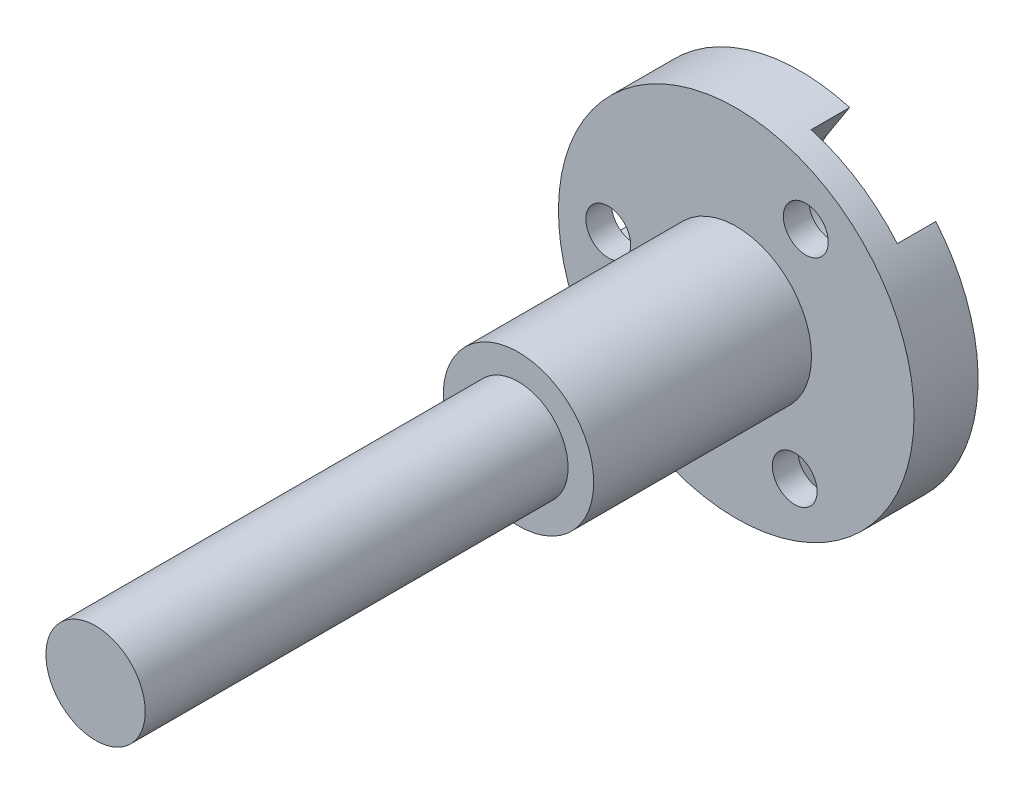
ISO-10303-21;
HEADER;
FILE_DESCRIPTION(('STEP AP214'),'2;1');
FILE_NAME('part.step','',(''),(''),'','','');
FILE_SCHEMA(('AUTOMOTIVE_DESIGN { 1 0 10303 214 1 1 1 1 }'));
ENDSEC;
DATA;
#1=APPLICATION_CONTEXT('core data for automotive mechanical design processes');
#2=APPLICATION_PROTOCOL_DEFINITION('international standard','automotive_design',2000,#1);
#3=PRODUCT_CONTEXT('',#1,'mechanical');
#4=PRODUCT('Part','Part','',(#3));
#5=PRODUCT_RELATED_PRODUCT_CATEGORY('part','',(#4));
#6=PRODUCT_DEFINITION_FORMATION('','',#4);
#7=PRODUCT_DEFINITION_CONTEXT('part definition',#1,'design');
#8=PRODUCT_DEFINITION('design','',#6,#7);
#9=PRODUCT_DEFINITION_SHAPE('','',#8);
#10=(LENGTH_UNIT() NAMED_UNIT(*) SI_UNIT(.MILLI.,.METRE.));
#11=(NAMED_UNIT(*) PLANE_ANGLE_UNIT() SI_UNIT($,.RADIAN.));
#12=(NAMED_UNIT(*) SI_UNIT($,.STERADIAN.) SOLID_ANGLE_UNIT());
#13=UNCERTAINTY_MEASURE_WITH_UNIT(LENGTH_MEASURE(1.E-05),#10,'distance_accuracy_value','');
#14=(GEOMETRIC_REPRESENTATION_CONTEXT(3) GLOBAL_UNCERTAINTY_ASSIGNED_CONTEXT((#13)) GLOBAL_UNIT_ASSIGNED_CONTEXT((#10,
#11,#12)) REPRESENTATION_CONTEXT('',''));
#15=CARTESIAN_POINT('',(0.,0.,0.));
#16=DIRECTION('',(0.,0.,1.));
#17=DIRECTION('',(1.,0.,0.));
#18=AXIS2_PLACEMENT_3D('',#15,#16,#17);
#19=CARTESIAN_POINT('',(5.42654757145298,8.39955840831726,55.));
#20=DIRECTION('',(0.,0.,-1.));
#21=DIRECTION('',(-1.,0.,0.));
#22=AXIS2_PLACEMENT_3D('',#19,#20,#21);
#23=CYLINDRICAL_SURFACE('',#22,1.75000000001934);
#24=CARTESIAN_POINT('',(5.42654757145298,8.39955840831726,5.));
#25=DIRECTION('',(0.,0.,1.));
#26=DIRECTION('',(1.,0.,0.));
#27=AXIS2_PLACEMENT_3D('',#24,#25,#26);
#28=CIRCLE('',#27,1.75000000001934);
#29=CARTESIAN_POINT('',(3.67654757143364,8.39955840831726,5.));
#30=VERTEX_POINT('',#29);
#31=EDGE_CURVE('E221',#30,#30,#28,.T.);
#32=CARTESIAN_POINT('',(5.42654757145298,8.39955840831726,3.));
#33=DIRECTION('',(0.,0.,-1.));
#34=DIRECTION('',(-1.,0.,0.));
#35=AXIS2_PLACEMENT_3D('',#32,#33,#34);
#36=CIRCLE('',#35,1.75000000001934);
#37=CARTESIAN_POINT('',(3.67654757143364,8.39955840831726,3.00000000000001));
#38=VERTEX_POINT('',#37);
#39=EDGE_CURVE('E43',#38,#38,#36,.F.);
#40=CARTESIAN_POINT('',(3.67654757143364,8.39955840831726,5.));
#41=CARTESIAN_POINT('',(3.67654757143364,8.39955840831726,4.97916666666666));
#42=CARTESIAN_POINT('',(3.67654757143364,8.39955840831726,4.95833333333333));
#43=CARTESIAN_POINT('',(3.67654757143364,8.39955840831726,4.91666666666666));
#44=CARTESIAN_POINT('',(3.67654757143364,8.39955840831726,4.89583333333333));
#45=CARTESIAN_POINT('',(3.67654757143364,8.39955840831726,4.85416666666666));
#46=CARTESIAN_POINT('',(3.67654757143364,8.39955840831726,4.83333333333333));
#47=CARTESIAN_POINT('',(3.67654757143364,8.39955840831726,4.79166666666666));
#48=CARTESIAN_POINT('',(3.67654757143364,8.39955840831726,4.77083333333333));
#49=CARTESIAN_POINT('',(3.67654757143364,8.39955840831726,4.72916666666666));
#50=CARTESIAN_POINT('',(3.67654757143364,8.39955840831726,4.70833333333333));
#51=CARTESIAN_POINT('',(3.67654757143364,8.39955840831726,4.66666666666666));
#52=CARTESIAN_POINT('',(3.67654757143364,8.39955840831726,4.64583333333333));
#53=CARTESIAN_POINT('',(3.67654757143364,8.39955840831726,4.60416666666666));
#54=CARTESIAN_POINT('',(3.67654757143364,8.39955840831726,4.58333333333333));
#55=CARTESIAN_POINT('',(3.67654757143364,8.39955840831726,4.54166666666666));
#56=CARTESIAN_POINT('',(3.67654757143364,8.39955840831726,4.52083333333333));
#57=CARTESIAN_POINT('',(3.67654757143364,8.39955840831726,4.47916666666667));
#58=CARTESIAN_POINT('',(3.67654757143364,8.39955840831726,4.45833333333333));
#59=CARTESIAN_POINT('',(3.67654757143364,8.39955840831726,4.41666666666667));
#60=CARTESIAN_POINT('',(3.67654757143364,8.39955840831726,4.39583333333334));
#61=CARTESIAN_POINT('',(3.67654757143364,8.39955840831726,4.35416666666667));
#62=CARTESIAN_POINT('',(3.67654757143364,8.39955840831726,4.33333333333334));
#63=CARTESIAN_POINT('',(3.67654757143364,8.39955840831726,4.29166666666667));
#64=CARTESIAN_POINT('',(3.67654757143364,8.39955840831726,4.27083333333334));
#65=CARTESIAN_POINT('',(3.67654757143364,8.39955840831726,4.22916666666667));
#66=CARTESIAN_POINT('',(3.67654757143364,8.39955840831726,4.20833333333334));
#67=CARTESIAN_POINT('',(3.67654757143364,8.39955840831726,4.16666666666667));
#68=CARTESIAN_POINT('',(3.67654757143364,8.39955840831726,4.14583333333334));
#69=CARTESIAN_POINT('',(3.67654757143364,8.39955840831726,4.10416666666667));
#70=CARTESIAN_POINT('',(3.67654757143364,8.39955840831726,4.08333333333334));
#71=CARTESIAN_POINT('',(3.67654757143364,8.39955840831726,4.04166666666667));
#72=CARTESIAN_POINT('',(3.67654757143364,8.39955840831726,4.02083333333334));
#73=CARTESIAN_POINT('',(3.67654757143364,8.39955840831726,3.97916666666667));
#74=CARTESIAN_POINT('',(3.67654757143364,8.39955840831726,3.95833333333334));
#75=CARTESIAN_POINT('',(3.67654757143364,8.39955840831726,3.91666666666667));
#76=CARTESIAN_POINT('',(3.67654757143364,8.39955840831726,3.89583333333334));
#77=CARTESIAN_POINT('',(3.67654757143364,8.39955840831726,3.85416666666667));
#78=CARTESIAN_POINT('',(3.67654757143364,8.39955840831726,3.83333333333334));
#79=CARTESIAN_POINT('',(3.67654757143364,8.39955840831726,3.79166666666667));
#80=CARTESIAN_POINT('',(3.67654757143364,8.39955840831726,3.77083333333334));
#81=CARTESIAN_POINT('',(3.67654757143364,8.39955840831726,3.72916666666667));
#82=CARTESIAN_POINT('',(3.67654757143364,8.39955840831726,3.70833333333334));
#83=CARTESIAN_POINT('',(3.67654757143364,8.39955840831726,3.66666666666667));
#84=CARTESIAN_POINT('',(3.67654757143364,8.39955840831726,3.64583333333334));
#85=CARTESIAN_POINT('',(3.67654757143364,8.39955840831726,3.60416666666667));
#86=CARTESIAN_POINT('',(3.67654757143364,8.39955840831726,3.58333333333334));
#87=CARTESIAN_POINT('',(3.67654757143364,8.39955840831726,3.54166666666667));
#88=CARTESIAN_POINT('',(3.67654757143364,8.39955840831726,3.52083333333334));
#89=CARTESIAN_POINT('',(3.67654757143364,8.39955840831726,3.47916666666668));
#90=CARTESIAN_POINT('',(3.67654757143364,8.39955840831726,3.45833333333334));
#91=CARTESIAN_POINT('',(3.67654757143364,8.39955840831726,3.41666666666668));
#92=CARTESIAN_POINT('',(3.67654757143364,8.39955840831726,3.39583333333334));
#93=CARTESIAN_POINT('',(3.67654757143364,8.39955840831726,3.35416666666668));
#94=CARTESIAN_POINT('',(3.67654757143364,8.39955840831726,3.33333333333334));
#95=CARTESIAN_POINT('',(3.67654757143364,8.39955840831726,3.29166666666668));
#96=CARTESIAN_POINT('',(3.67654757143364,8.39955840831726,3.27083333333334));
#97=CARTESIAN_POINT('',(3.67654757143364,8.39955840831726,3.22916666666668));
#98=CARTESIAN_POINT('',(3.67654757143364,8.39955840831726,3.20833333333334));
#99=CARTESIAN_POINT('',(3.67654757143364,8.39955840831726,3.16666666666668));
#100=CARTESIAN_POINT('',(3.67654757143364,8.39955840831726,3.14583333333334));
#101=CARTESIAN_POINT('',(3.67654757143364,8.39955840831726,3.10416666666668));
#102=CARTESIAN_POINT('',(3.67654757143364,8.39955840831726,3.08333333333334));
#103=CARTESIAN_POINT('',(3.67654757143364,8.39955840831726,3.04166666666668));
#104=CARTESIAN_POINT('',(3.67654757143364,8.39955840831726,3.02083333333334));
#105=CARTESIAN_POINT('',(3.67654757143364,8.39955840831726,3.00000000000001));
#106=B_SPLINE_CURVE_WITH_KNOTS('',3,(#40,#41,#42,#43,#44,#45,#46,#47,#48,#49,#50,#51,#52,#53,
#54,#55,#56,#57,#58,#59,#60,#61,#62,#63,#64,#65,#66,#67,#68,#69,#70,#71,#72,#73,#74,#75,#76,#77,
#78,#79,#80,#81,#82,#83,#84,#85,#86,#87,#88,#89,#90,#91,#92,#93,#94,#95,#96,#97,#98,#99,#100,
#101,#102,#103,#104,#105),.UNSPECIFIED.,.F.,.F.,(4,2,2,2,2,2,2,2,2,2,2,2,2,2,2,2,2,2,2,2,2,2,2,
2,2,2,2,2,2,2,2,2,4),(0.,0.0625000000000001,0.125,0.1875,0.25,0.3125,0.375,0.4375,0.5,
0.562499999999994,0.624999999999994,0.687499999999994,0.749999999999994,0.812499999999994,
0.874999999999994,0.937499999999994,0.999999999999994,1.06249999999999,1.12499999999999,
1.18749999999999,1.24999999999999,1.31249999999999,1.37499999999999,1.43749999999999,
1.49999999999999,1.56249999999999,1.62499999999999,1.68749999999999,1.74999999999999,
1.81249999999999,1.87499999999999,1.93749999999999,1.99999999999999),.UNSPECIFIED.);
#107=EDGE_CURVE('BSEAM39',#30,#38,#106,.T.);
#108=ORIENTED_EDGE('',*,*,#31,.T.);
#109=ORIENTED_EDGE('',*,*,#39,.F.);
#110=ORIENTED_EDGE('',*,*,#107,.T.);
#111=ORIENTED_EDGE('',*,*,#107,.F.);
#112=EDGE_LOOP('',(#108,#110,#109,#111));
#113=FACE_BOUND('',#112,.T.);
#114=ADVANCED_FACE('F39',(#113),#23,.F.);
#115=CARTESIAN_POINT('',(4.56095717644656,-8.89930725588395,55.));
#116=DIRECTION('',(0.,0.,-1.));
#117=DIRECTION('',(-1.,0.,0.));
#118=AXIS2_PLACEMENT_3D('',#115,#116,#117);
#119=CYLINDRICAL_SURFACE('',#118,1.74999999998179);
#120=CARTESIAN_POINT('',(4.56095717644656,-8.89930725588395,5.));
#121=DIRECTION('',(0.,0.,1.));
#122=DIRECTION('',(1.,0.,0.));
#123=AXIS2_PLACEMENT_3D('',#120,#121,#122);
#124=CIRCLE('',#123,1.74999999998179);
#125=CARTESIAN_POINT('',(2.81095717646477,-8.89930725588395,5.));
#126=VERTEX_POINT('',#125);
#127=EDGE_CURVE('E224',#126,#126,#124,.T.);
#128=CARTESIAN_POINT('',(4.56095717644656,-8.89930725588395,3.));
#129=DIRECTION('',(0.,0.,-1.));
#130=DIRECTION('',(-1.,0.,0.));
#131=AXIS2_PLACEMENT_3D('',#128,#129,#130);
#132=CIRCLE('',#131,1.74999999998179);
#133=CARTESIAN_POINT('',(2.81095717646477,-8.89930725588395,3.00000000000001));
#134=VERTEX_POINT('',#133);
#135=EDGE_CURVE('E200',#134,#134,#132,.F.);
#136=CARTESIAN_POINT('',(2.81095717646477,-8.89930725588395,5.));
#137=CARTESIAN_POINT('',(2.81095717646477,-8.89930725588395,4.97916666666666));
#138=CARTESIAN_POINT('',(2.81095717646477,-8.89930725588395,4.95833333333333));
#139=CARTESIAN_POINT('',(2.81095717646477,-8.89930725588395,4.91666666666666));
#140=CARTESIAN_POINT('',(2.81095717646477,-8.89930725588395,4.89583333333333));
#141=CARTESIAN_POINT('',(2.81095717646477,-8.89930725588395,4.85416666666666));
#142=CARTESIAN_POINT('',(2.81095717646477,-8.89930725588395,4.83333333333333));
#143=CARTESIAN_POINT('',(2.81095717646477,-8.89930725588395,4.79166666666666));
#144=CARTESIAN_POINT('',(2.81095717646477,-8.89930725588395,4.77083333333333));
#145=CARTESIAN_POINT('',(2.81095717646477,-8.89930725588395,4.72916666666666));
#146=CARTESIAN_POINT('',(2.81095717646477,-8.89930725588395,4.70833333333333));
#147=CARTESIAN_POINT('',(2.81095717646477,-8.89930725588395,4.66666666666666));
#148=CARTESIAN_POINT('',(2.81095717646477,-8.89930725588395,4.64583333333333));
#149=CARTESIAN_POINT('',(2.81095717646477,-8.89930725588395,4.60416666666666));
#150=CARTESIAN_POINT('',(2.81095717646477,-8.89930725588395,4.58333333333333));
#151=CARTESIAN_POINT('',(2.81095717646477,-8.89930725588395,4.54166666666666));
#152=CARTESIAN_POINT('',(2.81095717646477,-8.89930725588395,4.52083333333333));
#153=CARTESIAN_POINT('',(2.81095717646477,-8.89930725588395,4.47916666666667));
#154=CARTESIAN_POINT('',(2.81095717646477,-8.89930725588395,4.45833333333333));
#155=CARTESIAN_POINT('',(2.81095717646477,-8.89930725588395,4.41666666666667));
#156=CARTESIAN_POINT('',(2.81095717646477,-8.89930725588395,4.39583333333334));
#157=CARTESIAN_POINT('',(2.81095717646477,-8.89930725588395,4.35416666666667));
#158=CARTESIAN_POINT('',(2.81095717646477,-8.89930725588395,4.33333333333334));
#159=CARTESIAN_POINT('',(2.81095717646477,-8.89930725588395,4.29166666666667));
#160=CARTESIAN_POINT('',(2.81095717646477,-8.89930725588395,4.27083333333334));
#161=CARTESIAN_POINT('',(2.81095717646477,-8.89930725588395,4.22916666666667));
#162=CARTESIAN_POINT('',(2.81095717646477,-8.89930725588395,4.20833333333334));
#163=CARTESIAN_POINT('',(2.81095717646477,-8.89930725588395,4.16666666666667));
#164=CARTESIAN_POINT('',(2.81095717646477,-8.89930725588395,4.14583333333334));
#165=CARTESIAN_POINT('',(2.81095717646477,-8.89930725588395,4.10416666666667));
#166=CARTESIAN_POINT('',(2.81095717646477,-8.89930725588395,4.08333333333334));
#167=CARTESIAN_POINT('',(2.81095717646477,-8.89930725588395,4.04166666666667));
#168=CARTESIAN_POINT('',(2.81095717646477,-8.89930725588395,4.02083333333334));
#169=CARTESIAN_POINT('',(2.81095717646477,-8.89930725588395,3.97916666666667));
#170=CARTESIAN_POINT('',(2.81095717646477,-8.89930725588395,3.95833333333334));
#171=CARTESIAN_POINT('',(2.81095717646477,-8.89930725588395,3.91666666666667));
#172=CARTESIAN_POINT('',(2.81095717646477,-8.89930725588395,3.89583333333334));
#173=CARTESIAN_POINT('',(2.81095717646477,-8.89930725588395,3.85416666666667));
#174=CARTESIAN_POINT('',(2.81095717646477,-8.89930725588395,3.83333333333334));
#175=CARTESIAN_POINT('',(2.81095717646477,-8.89930725588395,3.79166666666667));
#176=CARTESIAN_POINT('',(2.81095717646477,-8.89930725588395,3.77083333333334));
#177=CARTESIAN_POINT('',(2.81095717646477,-8.89930725588395,3.72916666666667));
#178=CARTESIAN_POINT('',(2.81095717646477,-8.89930725588395,3.70833333333334));
#179=CARTESIAN_POINT('',(2.81095717646477,-8.89930725588395,3.66666666666667));
#180=CARTESIAN_POINT('',(2.81095717646477,-8.89930725588395,3.64583333333334));
#181=CARTESIAN_POINT('',(2.81095717646477,-8.89930725588395,3.60416666666667));
#182=CARTESIAN_POINT('',(2.81095717646477,-8.89930725588395,3.58333333333334));
#183=CARTESIAN_POINT('',(2.81095717646477,-8.89930725588395,3.54166666666667));
#184=CARTESIAN_POINT('',(2.81095717646477,-8.89930725588395,3.52083333333334));
#185=CARTESIAN_POINT('',(2.81095717646477,-8.89930725588395,3.47916666666668));
#186=CARTESIAN_POINT('',(2.81095717646477,-8.89930725588395,3.45833333333334));
#187=CARTESIAN_POINT('',(2.81095717646477,-8.89930725588395,3.41666666666668));
#188=CARTESIAN_POINT('',(2.81095717646477,-8.89930725588395,3.39583333333334));
#189=CARTESIAN_POINT('',(2.81095717646477,-8.89930725588395,3.35416666666668));
#190=CARTESIAN_POINT('',(2.81095717646477,-8.89930725588395,3.33333333333334));
#191=CARTESIAN_POINT('',(2.81095717646477,-8.89930725588395,3.29166666666668));
#192=CARTESIAN_POINT('',(2.81095717646477,-8.89930725588395,3.27083333333334));
#193=CARTESIAN_POINT('',(2.81095717646477,-8.89930725588395,3.22916666666668));
#194=CARTESIAN_POINT('',(2.81095717646477,-8.89930725588395,3.20833333333334));
#195=CARTESIAN_POINT('',(2.81095717646477,-8.89930725588395,3.16666666666668));
#196=CARTESIAN_POINT('',(2.81095717646477,-8.89930725588395,3.14583333333334));
#197=CARTESIAN_POINT('',(2.81095717646477,-8.89930725588395,3.10416666666668));
#198=CARTESIAN_POINT('',(2.81095717646477,-8.89930725588395,3.08333333333334));
#199=CARTESIAN_POINT('',(2.81095717646477,-8.89930725588395,3.04166666666668));
#200=CARTESIAN_POINT('',(2.81095717646477,-8.89930725588395,3.02083333333334));
#201=CARTESIAN_POINT('',(2.81095717646477,-8.89930725588395,3.00000000000001));
#202=B_SPLINE_CURVE_WITH_KNOTS('',3,(#136,#137,#138,#139,#140,#141,#142,#143,#144,#145,#146,
#147,#148,#149,#150,#151,#152,#153,#154,#155,#156,#157,#158,#159,#160,#161,#162,#163,#164,#165,
#166,#167,#168,#169,#170,#171,#172,#173,#174,#175,#176,#177,#178,#179,#180,#181,#182,#183,#184,
#185,#186,#187,#188,#189,#190,#191,#192,#193,#194,#195,#196,#197,#198,#199,#200,#201),
.UNSPECIFIED.,.F.,.F.,(4,2,2,2,2,2,2,2,2,2,2,2,2,2,2,2,2,2,2,2,2,2,2,2,2,2,2,2,2,2,2,2,4),(0.,
0.0625000000000001,0.125,0.1875,0.25,0.3125,0.375,0.4375,0.5,0.562499999999994,
0.624999999999994,0.687499999999994,0.749999999999994,0.812499999999994,0.874999999999994,
0.937499999999994,0.999999999999994,1.06249999999999,1.12499999999999,1.18749999999999,
1.24999999999999,1.31249999999999,1.37499999999999,1.43749999999999,1.49999999999999,
1.56249999999999,1.62499999999999,1.68749999999999,1.74999999999999,1.81249999999999,
1.87499999999999,1.93749999999999,1.99999999999999),.UNSPECIFIED.);
#203=EDGE_CURVE('BSEAM257',#126,#134,#202,.T.);
#204=ORIENTED_EDGE('',*,*,#127,.T.);
#205=ORIENTED_EDGE('',*,*,#135,.F.);
#206=ORIENTED_EDGE('',*,*,#203,.T.);
#207=ORIENTED_EDGE('',*,*,#203,.F.);
#208=EDGE_LOOP('',(#204,#206,#205,#207));
#209=FACE_BOUND('',#208,.T.);
#210=ADVANCED_FACE('F257',(#209),#119,.F.);
#211=CARTESIAN_POINT('',(-9.98750474790244,0.499748847563404,55.));
#212=DIRECTION('',(0.,0.,-1.));
#213=DIRECTION('',(-1.,0.,0.));
#214=AXIS2_PLACEMENT_3D('',#211,#212,#213);
#215=CYLINDRICAL_SURFACE('',#214,1.74999999999236);
#216=CARTESIAN_POINT('',(-9.98750474790244,0.499748847563404,5.));
#217=DIRECTION('',(0.,0.,1.));
#218=DIRECTION('',(1.,0.,0.));
#219=AXIS2_PLACEMENT_3D('',#216,#217,#218);
#220=CIRCLE('',#219,1.74999999999236);
#221=CARTESIAN_POINT('',(-11.7375047478948,0.499748847563404,5.));
#222=VERTEX_POINT('',#221);
#223=EDGE_CURVE('E227',#222,#222,#220,.T.);
#224=CARTESIAN_POINT('',(-9.98750474790244,0.499748847563404,3.));
#225=DIRECTION('',(0.,0.,-1.));
#226=DIRECTION('',(-1.,0.,0.));
#227=AXIS2_PLACEMENT_3D('',#224,#225,#226);
#228=CIRCLE('',#227,1.74999999999236);
#229=CARTESIAN_POINT('',(-11.7375047478948,0.499748847563404,3.00000000000001));
#230=VERTEX_POINT('',#229);
#231=EDGE_CURVE('E159',#230,#230,#228,.F.);
#232=CARTESIAN_POINT('',(-11.7375047478948,0.499748847563404,5.));
#233=CARTESIAN_POINT('',(-11.7375047478948,0.499748847563404,4.97916666666666));
#234=CARTESIAN_POINT('',(-11.7375047478948,0.499748847563404,4.95833333333333));
#235=CARTESIAN_POINT('',(-11.7375047478948,0.499748847563404,4.91666666666666));
#236=CARTESIAN_POINT('',(-11.7375047478948,0.499748847563404,4.89583333333333));
#237=CARTESIAN_POINT('',(-11.7375047478948,0.499748847563404,4.85416666666666));
#238=CARTESIAN_POINT('',(-11.7375047478948,0.499748847563404,4.83333333333333));
#239=CARTESIAN_POINT('',(-11.7375047478948,0.499748847563404,4.79166666666666));
#240=CARTESIAN_POINT('',(-11.7375047478948,0.499748847563404,4.77083333333333));
#241=CARTESIAN_POINT('',(-11.7375047478948,0.499748847563404,4.72916666666666));
#242=CARTESIAN_POINT('',(-11.7375047478948,0.499748847563404,4.70833333333333));
#243=CARTESIAN_POINT('',(-11.7375047478948,0.499748847563404,4.66666666666666));
#244=CARTESIAN_POINT('',(-11.7375047478948,0.499748847563404,4.64583333333333));
#245=CARTESIAN_POINT('',(-11.7375047478948,0.499748847563404,4.60416666666666));
#246=CARTESIAN_POINT('',(-11.7375047478948,0.499748847563404,4.58333333333333));
#247=CARTESIAN_POINT('',(-11.7375047478948,0.499748847563404,4.54166666666666));
#248=CARTESIAN_POINT('',(-11.7375047478948,0.499748847563404,4.52083333333333));
#249=CARTESIAN_POINT('',(-11.7375047478948,0.499748847563404,4.47916666666667));
#250=CARTESIAN_POINT('',(-11.7375047478948,0.499748847563404,4.45833333333333));
#251=CARTESIAN_POINT('',(-11.7375047478948,0.499748847563404,4.41666666666667));
#252=CARTESIAN_POINT('',(-11.7375047478948,0.499748847563404,4.39583333333334));
#253=CARTESIAN_POINT('',(-11.7375047478948,0.499748847563404,4.35416666666667));
#254=CARTESIAN_POINT('',(-11.7375047478948,0.499748847563404,4.33333333333334));
#255=CARTESIAN_POINT('',(-11.7375047478948,0.499748847563404,4.29166666666667));
#256=CARTESIAN_POINT('',(-11.7375047478948,0.499748847563404,4.27083333333334));
#257=CARTESIAN_POINT('',(-11.7375047478948,0.499748847563404,4.22916666666667));
#258=CARTESIAN_POINT('',(-11.7375047478948,0.499748847563404,4.20833333333334));
#259=CARTESIAN_POINT('',(-11.7375047478948,0.499748847563404,4.16666666666667));
#260=CARTESIAN_POINT('',(-11.7375047478948,0.499748847563404,4.14583333333334));
#261=CARTESIAN_POINT('',(-11.7375047478948,0.499748847563404,4.10416666666667));
#262=CARTESIAN_POINT('',(-11.7375047478948,0.499748847563404,4.08333333333334));
#263=CARTESIAN_POINT('',(-11.7375047478948,0.499748847563404,4.04166666666667));
#264=CARTESIAN_POINT('',(-11.7375047478948,0.499748847563404,4.02083333333334));
#265=CARTESIAN_POINT('',(-11.7375047478948,0.499748847563404,3.97916666666667));
#266=CARTESIAN_POINT('',(-11.7375047478948,0.499748847563404,3.95833333333334));
#267=CARTESIAN_POINT('',(-11.7375047478948,0.499748847563404,3.91666666666667));
#268=CARTESIAN_POINT('',(-11.7375047478948,0.499748847563404,3.89583333333334));
#269=CARTESIAN_POINT('',(-11.7375047478948,0.499748847563404,3.85416666666667));
#270=CARTESIAN_POINT('',(-11.7375047478948,0.499748847563404,3.83333333333334));
#271=CARTESIAN_POINT('',(-11.7375047478948,0.499748847563404,3.79166666666667));
#272=CARTESIAN_POINT('',(-11.7375047478948,0.499748847563404,3.77083333333334));
#273=CARTESIAN_POINT('',(-11.7375047478948,0.499748847563404,3.72916666666667));
#274=CARTESIAN_POINT('',(-11.7375047478948,0.499748847563404,3.70833333333334));
#275=CARTESIAN_POINT('',(-11.7375047478948,0.499748847563404,3.66666666666667));
#276=CARTESIAN_POINT('',(-11.7375047478948,0.499748847563404,3.64583333333334));
#277=CARTESIAN_POINT('',(-11.7375047478948,0.499748847563404,3.60416666666667));
#278=CARTESIAN_POINT('',(-11.7375047478948,0.499748847563404,3.58333333333334));
#279=CARTESIAN_POINT('',(-11.7375047478948,0.499748847563404,3.54166666666667));
#280=CARTESIAN_POINT('',(-11.7375047478948,0.499748847563404,3.52083333333334));
#281=CARTESIAN_POINT('',(-11.7375047478948,0.499748847563404,3.47916666666668));
#282=CARTESIAN_POINT('',(-11.7375047478948,0.499748847563404,3.45833333333334));
#283=CARTESIAN_POINT('',(-11.7375047478948,0.499748847563404,3.41666666666668));
#284=CARTESIAN_POINT('',(-11.7375047478948,0.499748847563404,3.39583333333334));
#285=CARTESIAN_POINT('',(-11.7375047478948,0.499748847563404,3.35416666666668));
#286=CARTESIAN_POINT('',(-11.7375047478948,0.499748847563404,3.33333333333334));
#287=CARTESIAN_POINT('',(-11.7375047478948,0.499748847563404,3.29166666666668));
#288=CARTESIAN_POINT('',(-11.7375047478948,0.499748847563404,3.27083333333334));
#289=CARTESIAN_POINT('',(-11.7375047478948,0.499748847563404,3.22916666666668));
#290=CARTESIAN_POINT('',(-11.7375047478948,0.499748847563404,3.20833333333334));
#291=CARTESIAN_POINT('',(-11.7375047478948,0.499748847563404,3.16666666666668));
#292=CARTESIAN_POINT('',(-11.7375047478948,0.499748847563404,3.14583333333334));
#293=CARTESIAN_POINT('',(-11.7375047478948,0.499748847563404,3.10416666666668));
#294=CARTESIAN_POINT('',(-11.7375047478948,0.499748847563404,3.08333333333334));
#295=CARTESIAN_POINT('',(-11.7375047478948,0.499748847563404,3.04166666666668));
#296=CARTESIAN_POINT('',(-11.7375047478948,0.499748847563404,3.02083333333334));
#297=CARTESIAN_POINT('',(-11.7375047478948,0.499748847563404,3.00000000000001));
#298=B_SPLINE_CURVE_WITH_KNOTS('',3,(#232,#233,#234,#235,#236,#237,#238,#239,#240,#241,#242,
#243,#244,#245,#246,#247,#248,#249,#250,#251,#252,#253,#254,#255,#256,#257,#258,#259,#260,#261,
#262,#263,#264,#265,#266,#267,#268,#269,#270,#271,#272,#273,#274,#275,#276,#277,#278,#279,#280,
#281,#282,#283,#284,#285,#286,#287,#288,#289,#290,#291,#292,#293,#294,#295,#296,#297),
.UNSPECIFIED.,.F.,.F.,(4,2,2,2,2,2,2,2,2,2,2,2,2,2,2,2,2,2,2,2,2,2,2,2,2,2,2,2,2,2,2,2,4),(0.,
0.0625000000000001,0.125,0.1875,0.25,0.3125,0.375,0.4375,0.5,0.562499999999994,
0.624999999999994,0.687499999999994,0.749999999999994,0.812499999999994,0.874999999999994,
0.937499999999994,0.999999999999994,1.06249999999999,1.12499999999999,1.18749999999999,
1.24999999999999,1.31249999999999,1.37499999999999,1.43749999999999,1.49999999999999,
1.56249999999999,1.62499999999999,1.68749999999999,1.74999999999999,1.81249999999999,
1.87499999999999,1.93749999999999,1.99999999999999),.UNSPECIFIED.);
#299=EDGE_CURVE('BSEAM259',#222,#230,#298,.T.);
#300=ORIENTED_EDGE('',*,*,#223,.T.);
#301=ORIENTED_EDGE('',*,*,#231,.F.);
#302=ORIENTED_EDGE('',*,*,#299,.T.);
#303=ORIENTED_EDGE('',*,*,#299,.F.);
#304=EDGE_LOOP('',(#300,#302,#301,#303));
#305=FACE_BOUND('',#304,.T.);
#306=ADVANCED_FACE('F259',(#305),#215,.F.);
#307=CARTESIAN_POINT('',(0.,0.,5.));
#308=DIRECTION('',(0.,0.,-1.));
#309=DIRECTION('',(-1.,0.,0.));
#310=AXIS2_PLACEMENT_3D('',#307,#308,#309);
#311=CYLINDRICAL_SURFACE('',#310,13.875);
#312=CARTESIAN_POINT('',(0.,0.,0.));
#313=DIRECTION('',(0.,0.,1.));
#314=DIRECTION('',(1.,0.,0.));
#315=AXIS2_PLACEMENT_3D('',#312,#313,#314);
#316=CIRCLE('',#315,13.875);
#317=CARTESIAN_POINT('',(-13.4692167463794,-3.33103966338624,0.));
#318=VERTEX_POINT('',#317);
#319=CARTESIAN_POINT('',(2.49992753800745,-13.6479297809123,0.));
#320=VERTEX_POINT('',#319);
#321=EDGE_CURVE('E249',#318,#320,#316,.T.);
#322=ORIENTED_EDGE('',*,*,#321,.T.);
#323=DIRECTION('',(0.,0.,-1.));
#324=VECTOR('',#323,1.);
#325=CARTESIAN_POINT('',(2.49992753800745,-13.6479297809123,5.));
#326=LINE('',#325,#324);
#327=CARTESIAN_POINT('',(2.49992753800746,-13.6479297809123,3.));
#328=VERTEX_POINT('',#327);
#329=EDGE_CURVE('E218',#320,#328,#326,.F.);
#330=ORIENTED_EDGE('',*,*,#329,.T.);
#331=CARTESIAN_POINT('',(0.,0.,3.));
#332=DIRECTION('',(0.,0.,-1.));
#333=DIRECTION('',(-1.,0.,0.));
#334=AXIS2_PLACEMENT_3D('',#331,#332,#333);
#335=CIRCLE('',#334,13.875);
#336=CARTESIAN_POINT('',(9.61937334270651,-9.9991640397399,3.));
#337=VERTEX_POINT('',#336);
#338=EDGE_CURVE('E201',#337,#328,#335,.T.);
#339=ORIENTED_EDGE('',*,*,#338,.F.);
#340=DIRECTION('',(0.,0.,-1.));
#341=VECTOR('',#340,1.);
#342=CARTESIAN_POINT('',(9.6193733427065,-9.9991640397399,5.));
#343=LINE('',#342,#341);
#344=CARTESIAN_POINT('',(9.61937334270651,-9.9991640397399,0.));
#345=VERTEX_POINT('',#344);
#346=EDGE_CURVE('E144',#337,#345,#343,.T.);
#347=ORIENTED_EDGE('',*,*,#346,.T.);
#348=CARTESIAN_POINT('',(10.5694901303253,8.98896564599933,0.));
#349=VERTEX_POINT('',#348);
#350=EDGE_CURVE('E244',#345,#349,#316,.T.);
#351=ORIENTED_EDGE('',*,*,#350,.T.);
#352=DIRECTION('',(0.,0.,-1.));
#353=VECTOR('',#352,1.);
#354=CARTESIAN_POINT('',(10.5694901303253,8.98896564599933,5.));
#355=LINE('',#354,#353);
#356=CARTESIAN_POINT('',(10.5694901303253,8.98896564599933,3.));
#357=VERTEX_POINT('',#356);
#358=EDGE_CURVE('E208',#349,#357,#355,.F.);
#359=ORIENTED_EDGE('',*,*,#358,.T.);
#360=CARTESIAN_POINT('',(0.,0.,3.));
#361=DIRECTION('',(0.,0.,-1.));
#362=DIRECTION('',(-1.,0.,0.));
#363=AXIS2_PLACEMENT_3D('',#360,#361,#362);
#364=CIRCLE('',#363,13.875);
#365=CARTESIAN_POINT('',(3.84984340365868,13.3302037031437,3.));
#366=VERTEX_POINT('',#365);
#367=EDGE_CURVE('E203',#366,#357,#364,.T.);
#368=ORIENTED_EDGE('',*,*,#367,.F.);
#369=DIRECTION('',(0.,0.,-1.));
#370=VECTOR('',#369,1.);
#371=CARTESIAN_POINT('',(3.84984340365868,13.3302037031437,5.));
#372=LINE('',#371,#370);
#373=CARTESIAN_POINT('',(3.84984340365868,13.3302037031437,0.));
#374=VERTEX_POINT('',#373);
#375=EDGE_CURVE('E205',#366,#374,#372,.T.);
#376=ORIENTED_EDGE('',*,*,#375,.T.);
#377=CARTESIAN_POINT('',(-13.0694176683445,4.65896413490868,0.));
#378=VERTEX_POINT('',#377);
#379=EDGE_CURVE('E48',#374,#378,#316,.T.);
#380=ORIENTED_EDGE('',*,*,#379,.T.);
#381=DIRECTION('',(0.,0.,-1.));
#382=VECTOR('',#381,1.);
#383=CARTESIAN_POINT('',(-13.0694176683445,4.65896413490868,5.));
#384=LINE('',#383,#382);
#385=CARTESIAN_POINT('',(-13.0694176683445,4.65896413490868,3.));
#386=VERTEX_POINT('',#385);
#387=EDGE_CURVE('E214',#378,#386,#384,.F.);
#388=ORIENTED_EDGE('',*,*,#387,.T.);
#389=CARTESIAN_POINT('',(0.,0.,3.));
#390=DIRECTION('',(0.,0.,-1.));
#391=DIRECTION('',(-1.,0.,0.));
#392=AXIS2_PLACEMENT_3D('',#389,#390,#391);
#393=CIRCLE('',#392,13.875);
#394=CARTESIAN_POINT('',(-13.4692167463794,-3.33103966338624,3.));
#395=VERTEX_POINT('',#394);
#396=EDGE_CURVE('E198',#395,#386,#393,.T.);
#397=ORIENTED_EDGE('',*,*,#396,.F.);
#398=DIRECTION('',(0.,0.,-1.));
#399=VECTOR('',#398,1.);
#400=CARTESIAN_POINT('',(-13.4692167463794,-3.33103966338624,5.));
#401=LINE('',#400,#399);
#402=EDGE_CURVE('E211',#395,#318,#401,.T.);
#403=ORIENTED_EDGE('',*,*,#402,.T.);
#404=EDGE_LOOP('',(#322,#330,#339,#347,#351,#359,#368,#376,#380,#388,#397,#403));
#405=FACE_BOUND('',#404,.T.);
#406=CARTESIAN_POINT('',(0.,0.,5.));
#407=DIRECTION('',(0.,0.,1.));
#408=DIRECTION('',(1.,0.,0.));
#409=AXIS2_PLACEMENT_3D('',#406,#407,#408);
#410=CIRCLE('',#409,13.875);
#411=CARTESIAN_POINT('',(13.875,0.,5.));
#412=VERTEX_POINT('',#411);
#413=EDGE_CURVE('E11',#412,#412,#410,.T.);
#414=ORIENTED_EDGE('',*,*,#413,.F.);
#415=EDGE_LOOP('',(#414));
#416=FACE_BOUND('',#415,.T.);
#417=ADVANCED_FACE('F41',(#405,#416),#311,.T.);
#418=CARTESIAN_POINT('',(0.,0.,5.));
#419=DIRECTION('',(0.,0.,1.));
#420=DIRECTION('',(1.,0.,0.));
#421=AXIS2_PLACEMENT_3D('',#418,#419,#420);
#422=PLANE('',#421);
#423=ORIENTED_EDGE('',*,*,#223,.F.);
#424=EDGE_LOOP('',(#423));
#425=FACE_BOUND('',#424,.T.);
#426=ORIENTED_EDGE('',*,*,#127,.F.);
#427=EDGE_LOOP('',(#426));
#428=FACE_BOUND('',#427,.T.);
#429=ORIENTED_EDGE('',*,*,#31,.F.);
#430=EDGE_LOOP('',(#429));
#431=FACE_BOUND('',#430,.T.);
#432=CARTESIAN_POINT('',(0.,0.,5.));
#433=DIRECTION('',(0.,0.,1.));
#434=DIRECTION('',(1.,0.,0.));
#435=AXIS2_PLACEMENT_3D('',#432,#433,#434);
#436=CIRCLE('',#435,5.875);
#437=CARTESIAN_POINT('',(5.875,0.,5.));
#438=VERTEX_POINT('',#437);
#439=EDGE_CURVE('E230',#438,#438,#436,.T.);
#440=ORIENTED_EDGE('',*,*,#439,.F.);
#441=EDGE_LOOP('',(#440));
#442=FACE_BOUND('',#441,.T.);
#443=ORIENTED_EDGE('',*,*,#413,.T.);
#444=EDGE_LOOP('',(#443));
#445=FACE_BOUND('',#444,.T.);
#446=ADVANCED_FACE('F298',(#425,#428,#431,#442,#445),#422,.T.);
#447=CARTESIAN_POINT('',(0.,0.,0.));
#448=DIRECTION('',(0.,0.,1.));
#449=DIRECTION('',(1.,0.,0.));
#450=AXIS2_PLACEMENT_3D('',#447,#448,#449);
#451=PLANE('',#450);
#452=CARTESIAN_POINT('',(0.,0.,0.));
#453=DIRECTION('',(0.,0.,-1.));
#454=DIRECTION('',(-1.,0.,0.));
#455=AXIS2_PLACEMENT_3D('',#452,#453,#454);
#456=CIRCLE('',#455,2.625);
#457=CARTESIAN_POINT('',(-2.625,0.,0.));
#458=VERTEX_POINT('',#457);
#459=EDGE_CURVE('E240',#458,#458,#456,.T.);
#460=ORIENTED_EDGE('',*,*,#459,.F.);
#461=EDGE_LOOP('',(#460));
#462=FACE_BOUND('',#461,.T.);
#463=CARTESIAN_POINT('',(4.56095717644656,-8.89930725588395,0.));
#464=DIRECTION('',(0.,0.,-1.));
#465=DIRECTION('',(-1.,0.,0.));
#466=AXIS2_PLACEMENT_3D('',#463,#464,#465);
#467=CIRCLE('',#466,4.00000000000001);
#468=CARTESIAN_POINT('',(1.00123427411612,-10.7236901264604,0.));
#469=VERTEX_POINT('',#468);
#470=CARTESIAN_POINT('',(8.12068007881517,-7.07492438528798,0.));
#471=VERTEX_POINT('',#470);
#472=EDGE_CURVE('E56',#469,#471,#467,.T.);
#473=ORIENTED_EDGE('',*,*,#472,.F.);
#474=DIRECTION('',(-0.456095717646547,0.88993072558738,0.));
#475=VECTOR('',#474,1.);
#476=CARTESIAN_POINT('',(1.00123427411612,-10.7236901264604,0.));
#477=LINE('',#476,#475);
#478=EDGE_CURVE('E151',#320,#469,#477,.T.);
#479=ORIENTED_EDGE('',*,*,#478,.F.);
#480=ORIENTED_EDGE('',*,*,#321,.F.);
#481=DIRECTION('',(-0.99875047479026,0.0499748847545386,0.));
#482=VECTOR('',#481,1.);
#483=CARTESIAN_POINT('',(-10.1874042869208,-3.49525305160204,0.));
#484=LINE('',#483,#482);
#485=CARTESIAN_POINT('',(-10.1874042869208,-3.49525305160204,0.));
#486=VERTEX_POINT('',#485);
#487=EDGE_CURVE('E169',#486,#318,#484,.T.);
#488=ORIENTED_EDGE('',*,*,#487,.F.);
#489=CARTESIAN_POINT('',(-9.98750474790244,0.499748847563404,0.));
#490=DIRECTION('',(0.,0.,-1.));
#491=DIRECTION('',(-1.,0.,0.));
#492=AXIS2_PLACEMENT_3D('',#489,#490,#491);
#493=CIRCLE('',#492,3.9999999999864);
#494=CARTESIAN_POINT('',(-9.78760520888587,4.49475074669288,0.));
#495=VERTEX_POINT('',#494);
#496=EDGE_CURVE('E64',#495,#486,#493,.T.);
#497=ORIENTED_EDGE('',*,*,#496,.F.);
#498=DIRECTION('',(0.99875047479026,-0.0499748847545379,0.));
#499=VECTOR('',#498,1.);
#500=CARTESIAN_POINT('',(-9.78760520888587,4.49475074669288,0.));
#501=LINE('',#500,#499);
#502=EDGE_CURVE('E167',#378,#495,#501,.T.);
#503=ORIENTED_EDGE('',*,*,#502,.F.);
#504=ORIENTED_EDGE('',*,*,#379,.F.);
#505=DIRECTION('',(0.542654757143045,0.839955840833328,0.));
#506=VECTOR('',#505,1.);
#507=CARTESIAN_POINT('',(2.06672420809646,10.5701774369044,0.));
#508=LINE('',#507,#506);
#509=CARTESIAN_POINT('',(2.06672420809646,10.5701774369044,0.));
#510=VERTEX_POINT('',#509);
#511=EDGE_CURVE('E188',#510,#374,#508,.T.);
#512=ORIENTED_EDGE('',*,*,#511,.F.);
#513=CARTESIAN_POINT('',(5.42654757145298,8.39955840831726,0.));
#514=DIRECTION('',(0.,0.,-1.));
#515=DIRECTION('',(-1.,0.,0.));
#516=AXIS2_PLACEMENT_3D('',#513,#514,#515);
#517=CIRCLE('',#516,4.);
#518=CARTESIAN_POINT('',(8.78637093476307,6.22893937976004,0.));
#519=VERTEX_POINT('',#518);
#520=EDGE_CURVE('E166',#519,#510,#517,.T.);
#521=ORIENTED_EDGE('',*,*,#520,.F.);
#522=DIRECTION('',(-0.542654757143046,-0.839955840833327,0.));
#523=VECTOR('',#522,1.);
#524=CARTESIAN_POINT('',(8.78637093476307,6.22893937976004,0.));
#525=LINE('',#524,#523);
#526=EDGE_CURVE('E186',#349,#519,#525,.T.);
#527=ORIENTED_EDGE('',*,*,#526,.F.);
#528=ORIENTED_EDGE('',*,*,#350,.F.);
#529=DIRECTION('',(0.456095717646546,-0.889930725587381,0.));
#530=VECTOR('',#529,1.);
#531=CARTESIAN_POINT('',(8.12068007881517,-7.07492438528798,0.));
#532=LINE('',#531,#530);
#533=EDGE_CURVE('E153',#471,#345,#532,.T.);
#534=ORIENTED_EDGE('',*,*,#533,.F.);
#535=EDGE_LOOP('',(#473,#479,#480,#488,#497,#503,#504,#512,#521,#527,#528,#534));
#536=FACE_BOUND('',#535,.T.);
#537=ADVANCED_FACE('F296',(#462,#536),#451,.F.);
#538=CARTESIAN_POINT('',(0.,0.,2.));
#539=DIRECTION('',(0.,0.,-1.));
#540=DIRECTION('',(-1.,0.,0.));
#541=AXIS2_PLACEMENT_3D('',#538,#539,#540);
#542=CYLINDRICAL_SURFACE('',#541,2.625);
#543=CARTESIAN_POINT('',(0.,0.,2.));
#544=DIRECTION('',(0.,0.,-1.));
#545=DIRECTION('',(-1.,0.,0.));
#546=AXIS2_PLACEMENT_3D('',#543,#544,#545);
#547=CIRCLE('',#546,2.625);
#548=CARTESIAN_POINT('',(-2.625,0.,2.));
#549=VERTEX_POINT('',#548);
#550=EDGE_CURVE('E241',#549,#549,#547,.T.);
#551=ORIENTED_EDGE('',*,*,#550,.F.);
#552=EDGE_LOOP('',(#551));
#553=FACE_BOUND('',#552,.T.);
#554=ORIENTED_EDGE('',*,*,#459,.T.);
#555=EDGE_LOOP('',(#554));
#556=FACE_BOUND('',#555,.T.);
#557=ADVANCED_FACE('F292',(#553,#556),#542,.F.);
#558=CARTESIAN_POINT('',(0.,0.,2.));
#559=DIRECTION('',(0.,0.,-1.));
#560=DIRECTION('',(-1.,0.,0.));
#561=AXIS2_PLACEMENT_3D('',#558,#559,#560);
#562=PLANE('',#561);
#563=ORIENTED_EDGE('',*,*,#550,.T.);
#564=EDGE_LOOP('',(#563));
#565=FACE_BOUND('',#564,.T.);
#566=ADVANCED_FACE('F280',(#565),#562,.T.);
#567=CARTESIAN_POINT('',(0.,0.,22.));
#568=DIRECTION('',(0.,0.,-1.));
#569=DIRECTION('',(-1.,0.,0.));
#570=AXIS2_PLACEMENT_3D('',#567,#568,#569);
#571=CYLINDRICAL_SURFACE('',#570,5.875);
#572=CARTESIAN_POINT('',(0.,0.,22.));
#573=DIRECTION('',(0.,0.,1.));
#574=DIRECTION('',(1.,0.,0.));
#575=AXIS2_PLACEMENT_3D('',#572,#573,#574);
#576=CIRCLE('',#575,5.875);
#577=CARTESIAN_POINT('',(5.875,0.,22.));
#578=VERTEX_POINT('',#577);
#579=EDGE_CURVE('E231',#578,#578,#576,.T.);
#580=ORIENTED_EDGE('',*,*,#579,.F.);
#581=EDGE_LOOP('',(#580));
#582=FACE_BOUND('',#581,.T.);
#583=ORIENTED_EDGE('',*,*,#439,.T.);
#584=EDGE_LOOP('',(#583));
#585=FACE_BOUND('',#584,.T.);
#586=ADVANCED_FACE('F276',(#582,#585),#571,.T.);
#587=CARTESIAN_POINT('',(0.,0.,22.));
#588=DIRECTION('',(0.,0.,1.));
#589=DIRECTION('',(1.,0.,0.));
#590=AXIS2_PLACEMENT_3D('',#587,#588,#589);
#591=PLANE('',#590);
#592=CARTESIAN_POINT('',(0.,0.,22.));
#593=DIRECTION('',(0.,0.,1.));
#594=DIRECTION('',(1.,0.,0.));
#595=AXIS2_PLACEMENT_3D('',#592,#593,#594);
#596=CIRCLE('',#595,3.875);
#597=CARTESIAN_POINT('',(3.875,0.,22.));
#598=VERTEX_POINT('',#597);
#599=EDGE_CURVE('E234',#598,#598,#596,.T.);
#600=ORIENTED_EDGE('',*,*,#599,.F.);
#601=EDGE_LOOP('',(#600));
#602=FACE_BOUND('',#601,.T.);
#603=ORIENTED_EDGE('',*,*,#579,.T.);
#604=EDGE_LOOP('',(#603));
#605=FACE_BOUND('',#604,.T.);
#606=ADVANCED_FACE('F272',(#602,#605),#591,.T.);
#607=CARTESIAN_POINT('',(0.,0.,55.));
#608=DIRECTION('',(0.,0.,1.));
#609=DIRECTION('',(1.,0.,0.));
#610=AXIS2_PLACEMENT_3D('',#607,#608,#609);
#611=PLANE('',#610);
#612=CARTESIAN_POINT('',(0.,0.,55.));
#613=DIRECTION('',(0.,0.,1.));
#614=DIRECTION('',(1.,0.,0.));
#615=AXIS2_PLACEMENT_3D('',#612,#613,#614);
#616=CIRCLE('',#615,3.875);
#617=CARTESIAN_POINT('',(3.875,0.,55.));
#618=VERTEX_POINT('',#617);
#619=EDGE_CURVE('E237',#618,#618,#616,.T.);
#620=ORIENTED_EDGE('',*,*,#619,.T.);
#621=EDGE_LOOP('',(#620));
#622=FACE_BOUND('',#621,.T.);
#623=ADVANCED_FACE('F275',(#622),#611,.T.);
#624=CARTESIAN_POINT('',(0.,0.,55.));
#625=DIRECTION('',(0.,0.,-1.));
#626=DIRECTION('',(-1.,0.,0.));
#627=AXIS2_PLACEMENT_3D('',#624,#625,#626);
#628=CYLINDRICAL_SURFACE('',#627,3.875);
#629=ORIENTED_EDGE('',*,*,#599,.T.);
#630=EDGE_LOOP('',(#629));
#631=FACE_BOUND('',#630,.T.);
#632=ORIENTED_EDGE('',*,*,#619,.F.);
#633=EDGE_LOOP('',(#632));
#634=FACE_BOUND('',#633,.T.);
#635=ADVANCED_FACE('F284',(#631,#634),#628,.T.);
#636=CARTESIAN_POINT('',(-9.78760520888587,4.49475074669288,3.));
#637=DIRECTION('',(0.0499748847545379,0.998750474790261,0.));
#638=DIRECTION('',(-0.998750474790261,0.0499748847545379,0.));
#639=AXIS2_PLACEMENT_3D('',#636,#637,#638);
#640=PLANE('',#639);
#641=ORIENTED_EDGE('',*,*,#502,.T.);
#642=DIRECTION('',(0.,0.,-1.));
#643=VECTOR('',#642,1.);
#644=CARTESIAN_POINT('',(-9.78760520888587,4.49475074669288,3.));
#645=LINE('',#644,#643);
#646=CARTESIAN_POINT('',(-9.78760520888587,4.49475074669288,3.));
#647=VERTEX_POINT('',#646);
#648=EDGE_CURVE('E164',#647,#495,#645,.T.);
#649=ORIENTED_EDGE('',*,*,#648,.F.);
#650=DIRECTION('',(0.99875047479026,-0.0499748847545379,0.));
#651=VECTOR('',#650,1.);
#652=CARTESIAN_POINT('',(-9.78760520888587,4.49475074669288,3.));
#653=LINE('',#652,#651);
#654=EDGE_CURVE('E163',#386,#647,#653,.T.);
#655=ORIENTED_EDGE('',*,*,#654,.F.);
#656=ORIENTED_EDGE('',*,*,#387,.F.);
#657=EDGE_LOOP('',(#641,#649,#655,#656));
#658=FACE_BOUND('',#657,.T.);
#659=ADVANCED_FACE('F288',(#658),#640,.F.);
#660=CARTESIAN_POINT('',(-10.1874042869208,-3.49525305160204,3.));
#661=DIRECTION('',(-0.0499748847545386,-0.99875047479026,0.));
#662=DIRECTION('',(0.998750474790261,-0.0499748847545386,0.));
#663=AXIS2_PLACEMENT_3D('',#660,#661,#662);
#664=PLANE('',#663);
#665=DIRECTION('',(-0.99875047479026,0.0499748847545386,0.));
#666=VECTOR('',#665,1.);
#667=CARTESIAN_POINT('',(-10.1874042869208,-3.49525305160204,3.));
#668=LINE('',#667,#666);
#669=CARTESIAN_POINT('',(-10.1874042869208,-3.49525305160204,3.));
#670=VERTEX_POINT('',#669);
#671=EDGE_CURVE('E174',#670,#395,#668,.T.);
#672=ORIENTED_EDGE('',*,*,#671,.F.);
#673=DIRECTION('',(0.,0.,-1.));
#674=VECTOR('',#673,1.);
#675=CARTESIAN_POINT('',(-10.1874042869208,-3.49525305160204,3.));
#676=LINE('',#675,#674);
#677=EDGE_CURVE('E161',#670,#486,#676,.T.);
#678=ORIENTED_EDGE('',*,*,#677,.T.);
#679=ORIENTED_EDGE('',*,*,#487,.T.);
#680=ORIENTED_EDGE('',*,*,#402,.F.);
#681=EDGE_LOOP('',(#672,#678,#679,#680));
#682=FACE_BOUND('',#681,.T.);
#683=ADVANCED_FACE('F333',(#682),#664,.F.);
#684=CARTESIAN_POINT('',(-9.98750474790244,0.499748847563404,3.));
#685=DIRECTION('',(0.,0.,-1.));
#686=DIRECTION('',(-1.,0.,0.));
#687=AXIS2_PLACEMENT_3D('',#684,#685,#686);
#688=PLANE('',#687);
#689=ORIENTED_EDGE('',*,*,#231,.T.);
#690=EDGE_LOOP('',(#689));
#691=FACE_BOUND('',#690,.T.);
#692=ORIENTED_EDGE('',*,*,#396,.T.);
#693=ORIENTED_EDGE('',*,*,#654,.T.);
#694=CARTESIAN_POINT('',(-9.98750474790244,0.499748847563404,3.));
#695=DIRECTION('',(0.,0.,-1.));
#696=DIRECTION('',(-1.,0.,0.));
#697=AXIS2_PLACEMENT_3D('',#694,#695,#696);
#698=CIRCLE('',#697,3.9999999999864);
#699=EDGE_CURVE('E170',#647,#670,#698,.T.);
#700=ORIENTED_EDGE('',*,*,#699,.T.);
#701=ORIENTED_EDGE('',*,*,#671,.T.);
#702=EDGE_LOOP('',(#692,#693,#700,#701));
#703=FACE_BOUND('',#702,.T.);
#704=ADVANCED_FACE('F326',(#691,#703),#688,.T.);
#705=CARTESIAN_POINT('',(-9.98750474790244,0.499748847563404,3.));
#706=DIRECTION('',(0.,0.,-1.));
#707=DIRECTION('',(-1.,0.,0.));
#708=AXIS2_PLACEMENT_3D('',#705,#706,#707);
#709=CYLINDRICAL_SURFACE('',#708,3.9999999999864);
#710=ORIENTED_EDGE('',*,*,#496,.T.);
#711=ORIENTED_EDGE('',*,*,#677,.F.);
#712=ORIENTED_EDGE('',*,*,#699,.F.);
#713=ORIENTED_EDGE('',*,*,#648,.T.);
#714=EDGE_LOOP('',(#710,#711,#712,#713));
#715=FACE_BOUND('',#714,.T.);
#716=ADVANCED_FACE('F319',(#715),#709,.F.);
#717=CARTESIAN_POINT('',(1.00123427411612,-10.7236901264604,3.));
#718=DIRECTION('',(-0.88993072558738,-0.456095717646547,0.));
#719=DIRECTION('',(0.456095717646547,-0.88993072558738,0.));
#720=AXIS2_PLACEMENT_3D('',#717,#718,#719);
#721=PLANE('',#720);
#722=ORIENTED_EDGE('',*,*,#478,.T.);
#723=DIRECTION('',(0.,0.,-1.));
#724=VECTOR('',#723,1.);
#725=CARTESIAN_POINT('',(1.00123427411612,-10.7236901264604,3.));
#726=LINE('',#725,#724);
#727=CARTESIAN_POINT('',(1.00123427411612,-10.7236901264604,3.));
#728=VERTEX_POINT('',#727);
#729=EDGE_CURVE('E137',#728,#469,#726,.T.);
#730=ORIENTED_EDGE('',*,*,#729,.F.);
#731=DIRECTION('',(-0.456095717646547,0.88993072558738,0.));
#732=VECTOR('',#731,1.);
#733=CARTESIAN_POINT('',(1.00123427411612,-10.7236901264604,3.));
#734=LINE('',#733,#732);
#735=EDGE_CURVE('E138',#328,#728,#734,.T.);
#736=ORIENTED_EDGE('',*,*,#735,.F.);
#737=ORIENTED_EDGE('',*,*,#329,.F.);
#738=EDGE_LOOP('',(#722,#730,#736,#737));
#739=FACE_BOUND('',#738,.T.);
#740=ADVANCED_FACE('F317',(#739),#721,.F.);
#741=CARTESIAN_POINT('',(8.12068007881517,-7.07492438528798,3.));
#742=DIRECTION('',(0.889930725587381,0.456095717646546,0.));
#743=DIRECTION('',(-0.456095717646546,0.889930725587381,0.));
#744=AXIS2_PLACEMENT_3D('',#741,#742,#743);
#745=PLANE('',#744);
#746=DIRECTION('',(0.456095717646546,-0.889930725587381,0.));
#747=VECTOR('',#746,1.);
#748=CARTESIAN_POINT('',(8.12068007881517,-7.07492438528798,3.));
#749=LINE('',#748,#747);
#750=CARTESIAN_POINT('',(8.12068007881517,-7.07492438528798,3.));
#751=VERTEX_POINT('',#750);
#752=EDGE_CURVE('E141',#751,#337,#749,.T.);
#753=ORIENTED_EDGE('',*,*,#752,.F.);
#754=DIRECTION('',(0.,0.,-1.));
#755=VECTOR('',#754,1.);
#756=CARTESIAN_POINT('',(8.12068007881517,-7.07492438528798,3.));
#757=LINE('',#756,#755);
#758=EDGE_CURVE('E130',#751,#471,#757,.T.);
#759=ORIENTED_EDGE('',*,*,#758,.T.);
#760=ORIENTED_EDGE('',*,*,#533,.T.);
#761=ORIENTED_EDGE('',*,*,#346,.F.);
#762=EDGE_LOOP('',(#753,#759,#760,#761));
#763=FACE_BOUND('',#762,.T.);
#764=ADVANCED_FACE('F142',(#763),#745,.F.);
#765=CARTESIAN_POINT('',(4.56095717644656,-8.89930725588395,3.));
#766=DIRECTION('',(0.,0.,-1.));
#767=DIRECTION('',(-1.,0.,0.));
#768=AXIS2_PLACEMENT_3D('',#765,#766,#767);
#769=PLANE('',#768);
#770=ORIENTED_EDGE('',*,*,#135,.T.);
#771=EDGE_LOOP('',(#770));
#772=FACE_BOUND('',#771,.T.);
#773=ORIENTED_EDGE('',*,*,#338,.T.);
#774=ORIENTED_EDGE('',*,*,#735,.T.);
#775=CARTESIAN_POINT('',(4.56095717644656,-8.89930725588395,3.));
#776=DIRECTION('',(0.,0.,-1.));
#777=DIRECTION('',(-1.,0.,0.));
#778=AXIS2_PLACEMENT_3D('',#775,#776,#777);
#779=CIRCLE('',#778,4.00000000000001);
#780=EDGE_CURVE('E134',#728,#751,#779,.T.);
#781=ORIENTED_EDGE('',*,*,#780,.T.);
#782=ORIENTED_EDGE('',*,*,#752,.T.);
#783=EDGE_LOOP('',(#773,#774,#781,#782));
#784=FACE_BOUND('',#783,.T.);
#785=ADVANCED_FACE('F148',(#772,#784),#769,.T.);
#786=CARTESIAN_POINT('',(4.56095717644656,-8.89930725588395,3.));
#787=DIRECTION('',(0.,0.,-1.));
#788=DIRECTION('',(-1.,0.,0.));
#789=AXIS2_PLACEMENT_3D('',#786,#787,#788);
#790=CYLINDRICAL_SURFACE('',#789,4.00000000000001);
#791=ORIENTED_EDGE('',*,*,#472,.T.);
#792=ORIENTED_EDGE('',*,*,#758,.F.);
#793=ORIENTED_EDGE('',*,*,#780,.F.);
#794=ORIENTED_EDGE('',*,*,#729,.T.);
#795=EDGE_LOOP('',(#791,#792,#793,#794));
#796=FACE_BOUND('',#795,.T.);
#797=ADVANCED_FACE('F132',(#796),#790,.F.);
#798=CARTESIAN_POINT('',(8.78637093476307,6.22893937976004,3.));
#799=DIRECTION('',(0.839955840833327,-0.542654757143046,0.));
#800=DIRECTION('',(0.542654757143046,0.839955840833327,0.));
#801=AXIS2_PLACEMENT_3D('',#798,#799,#800);
#802=PLANE('',#801);
#803=ORIENTED_EDGE('',*,*,#526,.T.);
#804=DIRECTION('',(0.,0.,-1.));
#805=VECTOR('',#804,1.);
#806=CARTESIAN_POINT('',(8.78637093476307,6.22893937976004,3.));
#807=LINE('',#806,#805);
#808=CARTESIAN_POINT('',(8.78637093476307,6.22893937976004,3.));
#809=VERTEX_POINT('',#808);
#810=EDGE_CURVE('E183',#809,#519,#807,.T.);
#811=ORIENTED_EDGE('',*,*,#810,.F.);
#812=DIRECTION('',(-0.542654757143046,-0.839955840833327,0.));
#813=VECTOR('',#812,1.);
#814=CARTESIAN_POINT('',(8.78637093476307,6.22893937976004,3.));
#815=LINE('',#814,#813);
#816=EDGE_CURVE('E182',#357,#809,#815,.T.);
#817=ORIENTED_EDGE('',*,*,#816,.F.);
#818=ORIENTED_EDGE('',*,*,#358,.F.);
#819=EDGE_LOOP('',(#803,#811,#817,#818));
#820=FACE_BOUND('',#819,.T.);
#821=ADVANCED_FACE('F331',(#820),#802,.F.);
#822=CARTESIAN_POINT('',(2.06672420809646,10.5701774369044,3.));
#823=DIRECTION('',(-0.839955840833328,0.542654757143045,0.));
#824=DIRECTION('',(-0.542654757143045,-0.839955840833328,0.));
#825=AXIS2_PLACEMENT_3D('',#822,#823,#824);
#826=PLANE('',#825);
#827=DIRECTION('',(0.542654757143045,0.839955840833328,0.));
#828=VECTOR('',#827,1.);
#829=CARTESIAN_POINT('',(2.06672420809646,10.5701774369044,3.));
#830=LINE('',#829,#828);
#831=CARTESIAN_POINT('',(2.06672420809646,10.5701774369044,3.));
#832=VERTEX_POINT('',#831);
#833=EDGE_CURVE('E193',#832,#366,#830,.T.);
#834=ORIENTED_EDGE('',*,*,#833,.F.);
#835=DIRECTION('',(0.,0.,-1.));
#836=VECTOR('',#835,1.);
#837=CARTESIAN_POINT('',(2.06672420809646,10.5701774369044,3.));
#838=LINE('',#837,#836);
#839=EDGE_CURVE('E179',#832,#510,#838,.T.);
#840=ORIENTED_EDGE('',*,*,#839,.T.);
#841=ORIENTED_EDGE('',*,*,#511,.T.);
#842=ORIENTED_EDGE('',*,*,#375,.F.);
#843=EDGE_LOOP('',(#834,#840,#841,#842));
#844=FACE_BOUND('',#843,.T.);
#845=ADVANCED_FACE('F347',(#844),#826,.F.);
#846=CARTESIAN_POINT('',(5.42654757145298,8.39955840831726,3.));
#847=DIRECTION('',(0.,0.,-1.));
#848=DIRECTION('',(-1.,0.,0.));
#849=AXIS2_PLACEMENT_3D('',#846,#847,#848);
#850=PLANE('',#849);
#851=ORIENTED_EDGE('',*,*,#39,.T.);
#852=EDGE_LOOP('',(#851));
#853=FACE_BOUND('',#852,.T.);
#854=ORIENTED_EDGE('',*,*,#367,.T.);
#855=ORIENTED_EDGE('',*,*,#816,.T.);
#856=CARTESIAN_POINT('',(5.42654757145298,8.39955840831726,3.));
#857=DIRECTION('',(0.,0.,-1.));
#858=DIRECTION('',(-1.,0.,0.));
#859=AXIS2_PLACEMENT_3D('',#856,#857,#858);
#860=CIRCLE('',#859,4.);
#861=EDGE_CURVE('E189',#809,#832,#860,.T.);
#862=ORIENTED_EDGE('',*,*,#861,.T.);
#863=ORIENTED_EDGE('',*,*,#833,.T.);
#864=EDGE_LOOP('',(#854,#855,#862,#863));
#865=FACE_BOUND('',#864,.T.);
#866=ADVANCED_FACE('F345',(#853,#865),#850,.T.);
#867=CARTESIAN_POINT('',(5.42654757145298,8.39955840831726,3.));
#868=DIRECTION('',(0.,0.,-1.));
#869=DIRECTION('',(-1.,0.,0.));
#870=AXIS2_PLACEMENT_3D('',#867,#868,#869);
#871=CYLINDRICAL_SURFACE('',#870,4.);
#872=ORIENTED_EDGE('',*,*,#520,.T.);
#873=ORIENTED_EDGE('',*,*,#839,.F.);
#874=ORIENTED_EDGE('',*,*,#861,.F.);
#875=ORIENTED_EDGE('',*,*,#810,.T.);
#876=EDGE_LOOP('',(#872,#873,#874,#875));
#877=FACE_BOUND('',#876,.T.);
#878=ADVANCED_FACE('F342',(#877),#871,.F.);
#879=CLOSED_SHELL('',(#114,#210,#306,#417,#446,#537,#557,#566,#586,#606,#623,#635,#659,#683,
#704,#716,#740,#764,#785,#797,#821,#845,#866,#878));
#880=MANIFOLD_SOLID_BREP('B2',#879);
#881=ADVANCED_BREP_SHAPE_REPRESENTATION('',(#18,#880),#14);
#882=SHAPE_DEFINITION_REPRESENTATION(#9,#881);
ENDSEC;
END-ISO-10303-21;
